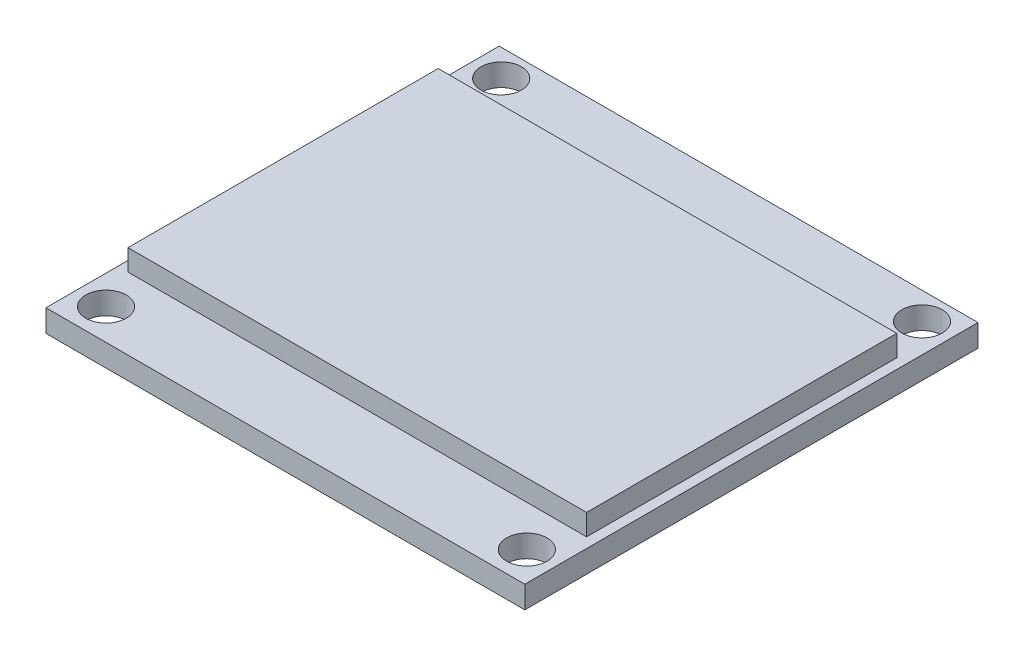
ISO-10303-21;
HEADER;
FILE_DESCRIPTION(('STEP AP214'),'2;1');
FILE_NAME('part.step','',(''),(''),'','','');
FILE_SCHEMA(('AUTOMOTIVE_DESIGN { 1 0 10303 214 1 1 1 1 }'));
ENDSEC;
DATA;
#1=APPLICATION_CONTEXT('core data for automotive mechanical design processes');
#2=APPLICATION_PROTOCOL_DEFINITION('international standard','automotive_design',2000,#1);
#3=PRODUCT_CONTEXT('',#1,'mechanical');
#4=PRODUCT('Part','Part','',(#3));
#5=PRODUCT_RELATED_PRODUCT_CATEGORY('part','',(#4));
#6=PRODUCT_DEFINITION_FORMATION('','',#4);
#7=PRODUCT_DEFINITION_CONTEXT('part definition',#1,'design');
#8=PRODUCT_DEFINITION('design','',#6,#7);
#9=PRODUCT_DEFINITION_SHAPE('','',#8);
#10=(LENGTH_UNIT() NAMED_UNIT(*) SI_UNIT(.MILLI.,.METRE.));
#11=(NAMED_UNIT(*) PLANE_ANGLE_UNIT() SI_UNIT($,.RADIAN.));
#12=(NAMED_UNIT(*) SI_UNIT($,.STERADIAN.) SOLID_ANGLE_UNIT());
#13=UNCERTAINTY_MEASURE_WITH_UNIT(LENGTH_MEASURE(1.E-05),#10,'distance_accuracy_value','');
#14=(GEOMETRIC_REPRESENTATION_CONTEXT(3) GLOBAL_UNCERTAINTY_ASSIGNED_CONTEXT((#13)) GLOBAL_UNIT_ASSIGNED_CONTEXT((#10,
#11,#12)) REPRESENTATION_CONTEXT('',''));
#15=CARTESIAN_POINT('',(0.,0.,0.));
#16=DIRECTION('',(0.,0.,1.));
#17=DIRECTION('',(1.,0.,0.));
#18=AXIS2_PLACEMENT_3D('',#15,#16,#17);
#19=CARTESIAN_POINT('',(0.,1.65,0.));
#20=DIRECTION('',(0.,1.,0.));
#21=DIRECTION('',(0.,0.,1.));
#22=AXIS2_PLACEMENT_3D('',#19,#20,#21);
#23=PLANE('',#22);
#24=CARTESIAN_POINT('',(-14.729271070615,1.65,19.3068337129841));
#25=DIRECTION('',(0.,1.,0.));
#26=DIRECTION('',(0.,0.,1.));
#27=AXIS2_PLACEMENT_3D('',#24,#25,#26);
#28=CIRCLE('',#27,1.5);
#29=CARTESIAN_POINT('',(-14.729271070615,1.65,20.8068337129841));
#30=VERTEX_POINT('',#29);
#31=EDGE_CURVE('E142',#30,#30,#28,.T.);
#32=ORIENTED_EDGE('',*,*,#31,.F.);
#33=EDGE_LOOP('',(#32));
#34=FACE_BOUND('',#33,.T.);
#35=CARTESIAN_POINT('',(-14.729271070615,1.65,-9.99316628701594));
#36=DIRECTION('',(0.,1.,0.));
#37=DIRECTION('',(0.,0.,1.));
#38=AXIS2_PLACEMENT_3D('',#35,#36,#37);
#39=CIRCLE('',#38,1.5);
#40=CARTESIAN_POINT('',(-14.729271070615,1.65,-8.49316628701594));
#41=VERTEX_POINT('',#40);
#42=EDGE_CURVE('E154',#41,#41,#39,.T.);
#43=ORIENTED_EDGE('',*,*,#42,.F.);
#44=EDGE_LOOP('',(#43));
#45=FACE_BOUND('',#44,.T.);
#46=DIRECTION('',(0.,0.,1.));
#47=VECTOR('',#46,1.);
#48=CARTESIAN_POINT('',(-16.879271070615,1.65,-11.9931662870159));
#49=LINE('',#48,#47);
#50=CARTESIAN_POINT('',(-16.879271070615,1.65,-11.9931662870159));
#51=VERTEX_POINT('',#50);
#52=CARTESIAN_POINT('',(-16.879271070615,1.65,21.6068337129841));
#53=VERTEX_POINT('',#52);
#54=EDGE_CURVE('E160',#51,#53,#49,.T.);
#55=ORIENTED_EDGE('',*,*,#54,.T.);
#56=DIRECTION('',(1.,0.,0.));
#57=VECTOR('',#56,1.);
#58=CARTESIAN_POINT('',(-16.879271070615,1.65,21.6068337129841));
#59=LINE('',#58,#57);
#60=CARTESIAN_POINT('',(18.620728929385,1.65,21.6068337129841));
#61=VERTEX_POINT('',#60);
#62=EDGE_CURVE('E84',#53,#61,#59,.T.);
#63=ORIENTED_EDGE('',*,*,#62,.T.);
#64=DIRECTION('',(0.,0.,-1.));
#65=VECTOR('',#64,1.);
#66=CARTESIAN_POINT('',(18.620728929385,1.65,-11.9931662870159));
#67=LINE('',#66,#65);
#68=CARTESIAN_POINT('',(18.620728929385,1.65,-11.9931662870159));
#69=VERTEX_POINT('',#68);
#70=EDGE_CURVE('E163',#61,#69,#67,.T.);
#71=ORIENTED_EDGE('',*,*,#70,.T.);
#72=DIRECTION('',(-1.,0.,0.));
#73=VECTOR('',#72,1.);
#74=CARTESIAN_POINT('',(-16.879271070615,1.65,-11.9931662870159));
#75=LINE('',#74,#73);
#76=EDGE_CURVE('E56',#69,#51,#75,.T.);
#77=ORIENTED_EDGE('',*,*,#76,.T.);
#78=EDGE_LOOP('',(#55,#63,#71,#77));
#79=FACE_BOUND('',#78,.T.);
#80=CARTESIAN_POINT('',(16.470728929385,1.65,-9.99316628701594));
#81=DIRECTION('',(0.,1.,0.));
#82=DIRECTION('',(0.,0.,1.));
#83=AXIS2_PLACEMENT_3D('',#80,#81,#82);
#84=CIRCLE('',#83,1.5);
#85=CARTESIAN_POINT('',(16.470728929385,1.65,-8.49316628701594));
#86=VERTEX_POINT('',#85);
#87=EDGE_CURVE('E148',#86,#86,#84,.T.);
#88=ORIENTED_EDGE('',*,*,#87,.F.);
#89=EDGE_LOOP('',(#88));
#90=FACE_BOUND('',#89,.T.);
#91=CARTESIAN_POINT('',(16.470728929385,1.65,19.3068337129841));
#92=DIRECTION('',(0.,1.,0.));
#93=DIRECTION('',(0.,0.,1.));
#94=AXIS2_PLACEMENT_3D('',#91,#92,#93);
#95=CIRCLE('',#94,1.5);
#96=CARTESIAN_POINT('',(16.470728929385,1.65,20.8068337129841));
#97=VERTEX_POINT('',#96);
#98=EDGE_CURVE('E134',#97,#97,#95,.T.);
#99=ORIENTED_EDGE('',*,*,#98,.F.);
#100=EDGE_LOOP('',(#99));
#101=FACE_BOUND('',#100,.T.);
#102=DIRECTION('',(1.,0.,0.));
#103=VECTOR('',#102,1.);
#104=CARTESIAN_POINT('',(-16.129271070615,1.65,16.2768337129841));
#105=LINE('',#104,#103);
#106=CARTESIAN_POINT('',(-16.129271070615,1.65,16.2768337129841));
#107=VERTEX_POINT('',#106);
#108=CARTESIAN_POINT('',(17.870728929385,1.65,16.2768337129841));
#109=VERTEX_POINT('',#108);
#110=EDGE_CURVE('E330',#107,#109,#105,.T.);
#111=ORIENTED_EDGE('',*,*,#110,.F.);
#112=DIRECTION('',(0.,0.,1.));
#113=VECTOR('',#112,1.);
#114=CARTESIAN_POINT('',(-16.129271070615,1.65,-6.72316628701594));
#115=LINE('',#114,#113);
#116=CARTESIAN_POINT('',(-16.129271070615,1.65,-6.72316628701594));
#117=VERTEX_POINT('',#116);
#118=EDGE_CURVE('E129',#117,#107,#115,.T.);
#119=ORIENTED_EDGE('',*,*,#118,.F.);
#120=DIRECTION('',(-1.,0.,0.));
#121=VECTOR('',#120,1.);
#122=CARTESIAN_POINT('',(-16.129271070615,1.65,-6.72316628701594));
#123=LINE('',#122,#121);
#124=CARTESIAN_POINT('',(17.870728929385,1.65,-6.72316628701595));
#125=VERTEX_POINT('',#124);
#126=EDGE_CURVE('E125',#125,#117,#123,.T.);
#127=ORIENTED_EDGE('',*,*,#126,.F.);
#128=DIRECTION('',(0.,0.,-1.));
#129=VECTOR('',#128,1.);
#130=CARTESIAN_POINT('',(17.870728929385,1.65,-6.72316628701595));
#131=LINE('',#130,#129);
#132=EDGE_CURVE('E327',#109,#125,#131,.T.);
#133=ORIENTED_EDGE('',*,*,#132,.F.);
#134=EDGE_LOOP('',(#111,#119,#127,#133));
#135=FACE_BOUND('',#134,.T.);
#136=ADVANCED_FACE('F32',(#34,#45,#79,#90,#101,#135),#23,.T.);
#137=CARTESIAN_POINT('',(0.,0.,0.));
#138=DIRECTION('',(0.,1.,0.));
#139=DIRECTION('',(0.,0.,1.));
#140=AXIS2_PLACEMENT_3D('',#137,#138,#139);
#141=PLANE('',#140);
#142=DIRECTION('',(0.,0.,1.));
#143=VECTOR('',#142,1.);
#144=CARTESIAN_POINT('',(-16.879271070615,0.,-11.9931662870159));
#145=LINE('',#144,#143);
#146=CARTESIAN_POINT('',(-16.879271070615,0.,-11.9931662870159));
#147=VERTEX_POINT('',#146);
#148=CARTESIAN_POINT('',(-16.879271070615,0.,21.6068337129841));
#149=VERTEX_POINT('',#148);
#150=EDGE_CURVE('E157',#147,#149,#145,.T.);
#151=ORIENTED_EDGE('',*,*,#150,.F.);
#152=DIRECTION('',(-1.,0.,0.));
#153=VECTOR('',#152,1.);
#154=CARTESIAN_POINT('',(-16.879271070615,0.,-11.9931662870159));
#155=LINE('',#154,#153);
#156=CARTESIAN_POINT('',(18.620728929385,0.,-11.9931662870159));
#157=VERTEX_POINT('',#156);
#158=EDGE_CURVE('E77',#157,#147,#155,.T.);
#159=ORIENTED_EDGE('',*,*,#158,.F.);
#160=DIRECTION('',(0.,0.,-1.));
#161=VECTOR('',#160,1.);
#162=CARTESIAN_POINT('',(18.620728929385,0.,-11.9931662870159));
#163=LINE('',#162,#161);
#164=CARTESIAN_POINT('',(18.620728929385,0.,21.6068337129841));
#165=VERTEX_POINT('',#164);
#166=EDGE_CURVE('E171',#165,#157,#163,.T.);
#167=ORIENTED_EDGE('',*,*,#166,.F.);
#168=DIRECTION('',(1.,0.,0.));
#169=VECTOR('',#168,1.);
#170=CARTESIAN_POINT('',(-16.879271070615,0.,21.6068337129841));
#171=LINE('',#170,#169);
#172=EDGE_CURVE('E169',#149,#165,#171,.T.);
#173=ORIENTED_EDGE('',*,*,#172,.F.);
#174=EDGE_LOOP('',(#151,#159,#167,#173));
#175=FACE_BOUND('',#174,.T.);
#176=CARTESIAN_POINT('',(-14.729271070615,0.,-9.99316628701594));
#177=DIRECTION('',(0.,1.,0.));
#178=DIRECTION('',(0.,0.,1.));
#179=AXIS2_PLACEMENT_3D('',#176,#177,#178);
#180=CIRCLE('',#179,1.5);
#181=CARTESIAN_POINT('',(-14.729271070615,0.,-8.49316628701594));
#182=VERTEX_POINT('',#181);
#183=EDGE_CURVE('E151',#182,#182,#180,.T.);
#184=ORIENTED_EDGE('',*,*,#183,.T.);
#185=EDGE_LOOP('',(#184));
#186=FACE_BOUND('',#185,.T.);
#187=CARTESIAN_POINT('',(16.470728929385,0.,-9.99316628701594));
#188=DIRECTION('',(0.,1.,0.));
#189=DIRECTION('',(0.,0.,1.));
#190=AXIS2_PLACEMENT_3D('',#187,#188,#189);
#191=CIRCLE('',#190,1.5);
#192=CARTESIAN_POINT('',(16.470728929385,0.,-8.49316628701594));
#193=VERTEX_POINT('',#192);
#194=EDGE_CURVE('E145',#193,#193,#191,.T.);
#195=ORIENTED_EDGE('',*,*,#194,.T.);
#196=EDGE_LOOP('',(#195));
#197=FACE_BOUND('',#196,.T.);
#198=CARTESIAN_POINT('',(-14.729271070615,0.,19.3068337129841));
#199=DIRECTION('',(0.,1.,0.));
#200=DIRECTION('',(0.,0.,1.));
#201=AXIS2_PLACEMENT_3D('',#198,#199,#200);
#202=CIRCLE('',#201,1.5);
#203=CARTESIAN_POINT('',(-14.729271070615,0.,20.8068337129841));
#204=VERTEX_POINT('',#203);
#205=EDGE_CURVE('E140',#204,#204,#202,.T.);
#206=ORIENTED_EDGE('',*,*,#205,.T.);
#207=EDGE_LOOP('',(#206));
#208=FACE_BOUND('',#207,.T.);
#209=CARTESIAN_POINT('',(16.470728929385,0.,19.3068337129841));
#210=DIRECTION('',(0.,1.,0.));
#211=DIRECTION('',(0.,0.,1.));
#212=AXIS2_PLACEMENT_3D('',#209,#210,#211);
#213=CIRCLE('',#212,1.5);
#214=CARTESIAN_POINT('',(16.470728929385,0.,20.8068337129841));
#215=VERTEX_POINT('',#214);
#216=EDGE_CURVE('E131',#215,#215,#213,.T.);
#217=ORIENTED_EDGE('',*,*,#216,.T.);
#218=EDGE_LOOP('',(#217));
#219=FACE_BOUND('',#218,.T.);
#220=ADVANCED_FACE('F184',(#175,#186,#197,#208,#219),#141,.F.);
#221=CARTESIAN_POINT('',(-16.879271070615,1.65,-11.9931662870159));
#222=DIRECTION('',(1.,0.,0.));
#223=DIRECTION('',(0.,0.,-1.));
#224=AXIS2_PLACEMENT_3D('',#221,#222,#223);
#225=PLANE('',#224);
#226=ORIENTED_EDGE('',*,*,#150,.T.);
#227=DIRECTION('',(0.,-1.,0.));
#228=VECTOR('',#227,1.);
#229=CARTESIAN_POINT('',(-16.879271070615,1.65,21.6068337129841));
#230=LINE('',#229,#228);
#231=EDGE_CURVE('E11',#53,#149,#230,.T.);
#232=ORIENTED_EDGE('',*,*,#231,.F.);
#233=ORIENTED_EDGE('',*,*,#54,.F.);
#234=DIRECTION('',(0.,-1.,0.));
#235=VECTOR('',#234,1.);
#236=CARTESIAN_POINT('',(-16.879271070615,1.65,-11.9931662870159));
#237=LINE('',#236,#235);
#238=EDGE_CURVE('E166',#51,#147,#237,.T.);
#239=ORIENTED_EDGE('',*,*,#238,.T.);
#240=EDGE_LOOP('',(#226,#232,#233,#239));
#241=FACE_BOUND('',#240,.T.);
#242=ADVANCED_FACE('F34',(#241),#225,.F.);
#243=CARTESIAN_POINT('',(-16.879271070615,1.65,21.6068337129841));
#244=DIRECTION('',(0.,0.,-1.));
#245=DIRECTION('',(-1.,0.,0.));
#246=AXIS2_PLACEMENT_3D('',#243,#244,#245);
#247=PLANE('',#246);
#248=ORIENTED_EDGE('',*,*,#172,.T.);
#249=DIRECTION('',(0.,-1.,0.));
#250=VECTOR('',#249,1.);
#251=CARTESIAN_POINT('',(18.620728929385,1.65,21.6068337129841));
#252=LINE('',#251,#250);
#253=EDGE_CURVE('E40',#61,#165,#252,.T.);
#254=ORIENTED_EDGE('',*,*,#253,.F.);
#255=ORIENTED_EDGE('',*,*,#62,.F.);
#256=ORIENTED_EDGE('',*,*,#231,.T.);
#257=EDGE_LOOP('',(#248,#254,#255,#256));
#258=FACE_BOUND('',#257,.T.);
#259=ADVANCED_FACE('F200',(#258),#247,.F.);
#260=CARTESIAN_POINT('',(18.620728929385,1.65,-11.9931662870159));
#261=DIRECTION('',(-1.,0.,0.));
#262=DIRECTION('',(0.,0.,1.));
#263=AXIS2_PLACEMENT_3D('',#260,#261,#262);
#264=PLANE('',#263);
#265=ORIENTED_EDGE('',*,*,#166,.T.);
#266=DIRECTION('',(0.,-1.,0.));
#267=VECTOR('',#266,1.);
#268=CARTESIAN_POINT('',(18.620728929385,1.65,-11.9931662870159));
#269=LINE('',#268,#267);
#270=EDGE_CURVE('E175',#69,#157,#269,.T.);
#271=ORIENTED_EDGE('',*,*,#270,.F.);
#272=ORIENTED_EDGE('',*,*,#70,.F.);
#273=ORIENTED_EDGE('',*,*,#253,.T.);
#274=EDGE_LOOP('',(#265,#271,#272,#273));
#275=FACE_BOUND('',#274,.T.);
#276=ADVANCED_FACE('F180',(#275),#264,.F.);
#277=CARTESIAN_POINT('',(-16.879271070615,1.65,-11.9931662870159));
#278=DIRECTION('',(0.,0.,1.));
#279=DIRECTION('',(1.,0.,0.));
#280=AXIS2_PLACEMENT_3D('',#277,#278,#279);
#281=PLANE('',#280);
#282=ORIENTED_EDGE('',*,*,#158,.T.);
#283=ORIENTED_EDGE('',*,*,#238,.F.);
#284=ORIENTED_EDGE('',*,*,#76,.F.);
#285=ORIENTED_EDGE('',*,*,#270,.T.);
#286=EDGE_LOOP('',(#282,#283,#284,#285));
#287=FACE_BOUND('',#286,.T.);
#288=ADVANCED_FACE('F189',(#287),#281,.F.);
#289=CARTESIAN_POINT('',(-14.729271070615,1.65,-9.99316628701594));
#290=DIRECTION('',(0.,-1.,0.));
#291=DIRECTION('',(0.,0.,-1.));
#292=AXIS2_PLACEMENT_3D('',#289,#290,#291);
#293=CYLINDRICAL_SURFACE('',#292,1.5);
#294=ORIENTED_EDGE('',*,*,#42,.T.);
#295=EDGE_LOOP('',(#294));
#296=FACE_BOUND('',#295,.T.);
#297=ORIENTED_EDGE('',*,*,#183,.F.);
#298=EDGE_LOOP('',(#297));
#299=FACE_BOUND('',#298,.T.);
#300=ADVANCED_FACE('F191',(#296,#299),#293,.F.);
#301=CARTESIAN_POINT('',(16.470728929385,1.65,-9.99316628701594));
#302=DIRECTION('',(0.,-1.,0.));
#303=DIRECTION('',(0.,0.,-1.));
#304=AXIS2_PLACEMENT_3D('',#301,#302,#303);
#305=CYLINDRICAL_SURFACE('',#304,1.5);
#306=ORIENTED_EDGE('',*,*,#87,.T.);
#307=EDGE_LOOP('',(#306));
#308=FACE_BOUND('',#307,.T.);
#309=ORIENTED_EDGE('',*,*,#194,.F.);
#310=EDGE_LOOP('',(#309));
#311=FACE_BOUND('',#310,.T.);
#312=ADVANCED_FACE('F197',(#308,#311),#305,.F.);
#313=CARTESIAN_POINT('',(-14.729271070615,1.65,19.3068337129841));
#314=DIRECTION('',(0.,-1.,0.));
#315=DIRECTION('',(0.,0.,-1.));
#316=AXIS2_PLACEMENT_3D('',#313,#314,#315);
#317=CYLINDRICAL_SURFACE('',#316,1.5);
#318=ORIENTED_EDGE('',*,*,#31,.T.);
#319=EDGE_LOOP('',(#318));
#320=FACE_BOUND('',#319,.T.);
#321=ORIENTED_EDGE('',*,*,#205,.F.);
#322=EDGE_LOOP('',(#321));
#323=FACE_BOUND('',#322,.T.);
#324=ADVANCED_FACE('F214',(#320,#323),#317,.F.);
#325=CARTESIAN_POINT('',(16.470728929385,1.65,19.3068337129841));
#326=DIRECTION('',(0.,-1.,0.));
#327=DIRECTION('',(0.,0.,-1.));
#328=AXIS2_PLACEMENT_3D('',#325,#326,#327);
#329=CYLINDRICAL_SURFACE('',#328,1.5);
#330=ORIENTED_EDGE('',*,*,#98,.T.);
#331=EDGE_LOOP('',(#330));
#332=FACE_BOUND('',#331,.T.);
#333=ORIENTED_EDGE('',*,*,#216,.F.);
#334=EDGE_LOOP('',(#333));
#335=FACE_BOUND('',#334,.T.);
#336=ADVANCED_FACE('F218',(#332,#335),#329,.F.);
#337=CARTESIAN_POINT('',(-16.129271070615,3.22,-6.72316628701594));
#338=DIRECTION('',(1.,0.,0.));
#339=DIRECTION('',(0.,0.,-1.));
#340=AXIS2_PLACEMENT_3D('',#337,#338,#339);
#341=PLANE('',#340);
#342=ORIENTED_EDGE('',*,*,#118,.T.);
#343=DIRECTION('',(0.,-1.,0.));
#344=VECTOR('',#343,1.);
#345=CARTESIAN_POINT('',(-16.129271070615,3.22,16.2768337129841));
#346=LINE('',#345,#344);
#347=CARTESIAN_POINT('',(-16.129271070615,3.22,16.2768337129841));
#348=VERTEX_POINT('',#347);
#349=EDGE_CURVE('E110',#348,#107,#346,.T.);
#350=ORIENTED_EDGE('',*,*,#349,.F.);
#351=DIRECTION('',(0.,0.,1.));
#352=VECTOR('',#351,1.);
#353=CARTESIAN_POINT('',(-16.129271070615,3.22,-6.72316628701594));
#354=LINE('',#353,#352);
#355=CARTESIAN_POINT('',(-16.129271070615,3.22,-6.72316628701594));
#356=VERTEX_POINT('',#355);
#357=EDGE_CURVE('E117',#356,#348,#354,.T.);
#358=ORIENTED_EDGE('',*,*,#357,.F.);
#359=DIRECTION('',(0.,-1.,0.));
#360=VECTOR('',#359,1.);
#361=CARTESIAN_POINT('',(-16.129271070615,3.22,-6.72316628701594));
#362=LINE('',#361,#360);
#363=EDGE_CURVE('E324',#356,#117,#362,.T.);
#364=ORIENTED_EDGE('',*,*,#363,.T.);
#365=EDGE_LOOP('',(#342,#350,#358,#364));
#366=FACE_BOUND('',#365,.T.);
#367=ADVANCED_FACE('F127',(#366),#341,.F.);
#368=CARTESIAN_POINT('',(-16.129271070615,3.22,16.2768337129841));
#369=DIRECTION('',(0.,0.,-1.));
#370=DIRECTION('',(-1.,0.,0.));
#371=AXIS2_PLACEMENT_3D('',#368,#369,#370);
#372=PLANE('',#371);
#373=ORIENTED_EDGE('',*,*,#110,.T.);
#374=DIRECTION('',(0.,-1.,0.));
#375=VECTOR('',#374,1.);
#376=CARTESIAN_POINT('',(17.870728929385,3.22,16.2768337129841));
#377=LINE('',#376,#375);
#378=CARTESIAN_POINT('',(17.870728929385,3.22,16.2768337129841));
#379=VERTEX_POINT('',#378);
#380=EDGE_CURVE('E113',#379,#109,#377,.T.);
#381=ORIENTED_EDGE('',*,*,#380,.F.);
#382=DIRECTION('',(1.,0.,0.));
#383=VECTOR('',#382,1.);
#384=CARTESIAN_POINT('',(-16.129271070615,3.22,16.2768337129841));
#385=LINE('',#384,#383);
#386=EDGE_CURVE('E106',#348,#379,#385,.T.);
#387=ORIENTED_EDGE('',*,*,#386,.F.);
#388=ORIENTED_EDGE('',*,*,#349,.T.);
#389=EDGE_LOOP('',(#373,#381,#387,#388));
#390=FACE_BOUND('',#389,.T.);
#391=ADVANCED_FACE('F108',(#390),#372,.F.);
#392=CARTESIAN_POINT('',(17.870728929385,3.22,-6.72316628701595));
#393=DIRECTION('',(-1.,0.,0.));
#394=DIRECTION('',(0.,0.,1.));
#395=AXIS2_PLACEMENT_3D('',#392,#393,#394);
#396=PLANE('',#395);
#397=ORIENTED_EDGE('',*,*,#132,.T.);
#398=DIRECTION('',(0.,-1.,0.));
#399=VECTOR('',#398,1.);
#400=CARTESIAN_POINT('',(17.870728929385,3.22,-6.72316628701595));
#401=LINE('',#400,#399);
#402=CARTESIAN_POINT('',(17.870728929385,3.22,-6.72316628701595));
#403=VERTEX_POINT('',#402);
#404=EDGE_CURVE('E47',#403,#125,#401,.T.);
#405=ORIENTED_EDGE('',*,*,#404,.F.);
#406=DIRECTION('',(0.,0.,-1.));
#407=VECTOR('',#406,1.);
#408=CARTESIAN_POINT('',(17.870728929385,3.22,-6.72316628701595));
#409=LINE('',#408,#407);
#410=EDGE_CURVE('E116',#379,#403,#409,.T.);
#411=ORIENTED_EDGE('',*,*,#410,.F.);
#412=ORIENTED_EDGE('',*,*,#380,.T.);
#413=EDGE_LOOP('',(#397,#405,#411,#412));
#414=FACE_BOUND('',#413,.T.);
#415=ADVANCED_FACE('F227',(#414),#396,.F.);
#416=CARTESIAN_POINT('',(-16.129271070615,3.22,-6.72316628701594));
#417=DIRECTION('',(0.,0.,1.));
#418=DIRECTION('',(1.,0.,0.));
#419=AXIS2_PLACEMENT_3D('',#416,#417,#418);
#420=PLANE('',#419);
#421=ORIENTED_EDGE('',*,*,#126,.T.);
#422=ORIENTED_EDGE('',*,*,#363,.F.);
#423=DIRECTION('',(-1.,0.,0.));
#424=VECTOR('',#423,1.);
#425=CARTESIAN_POINT('',(-16.129271070615,3.22,-6.72316628701594));
#426=LINE('',#425,#424);
#427=EDGE_CURVE('E121',#403,#356,#426,.T.);
#428=ORIENTED_EDGE('',*,*,#427,.F.);
#429=ORIENTED_EDGE('',*,*,#404,.T.);
#430=EDGE_LOOP('',(#421,#422,#428,#429));
#431=FACE_BOUND('',#430,.T.);
#432=ADVANCED_FACE('F230',(#431),#420,.F.);
#433=CARTESIAN_POINT('',(0.,3.22,0.));
#434=DIRECTION('',(0.,1.,0.));
#435=DIRECTION('',(0.,0.,1.));
#436=AXIS2_PLACEMENT_3D('',#433,#434,#435);
#437=PLANE('',#436);
#438=ORIENTED_EDGE('',*,*,#357,.T.);
#439=ORIENTED_EDGE('',*,*,#386,.T.);
#440=ORIENTED_EDGE('',*,*,#410,.T.);
#441=ORIENTED_EDGE('',*,*,#427,.T.);
#442=EDGE_LOOP('',(#438,#439,#440,#441));
#443=FACE_BOUND('',#442,.T.);
#444=ADVANCED_FACE('F120',(#443),#437,.T.);
#445=CLOSED_SHELL('',(#136,#220,#242,#259,#276,#288,#300,#312,#324,#336,#367,#391,#415,#432,#444));
#446=MANIFOLD_SOLID_BREP('B2',#445);
#447=ADVANCED_BREP_SHAPE_REPRESENTATION('',(#18,#446),#14);
#448=SHAPE_DEFINITION_REPRESENTATION(#9,#447);
ENDSEC;
END-ISO-10303-21;
